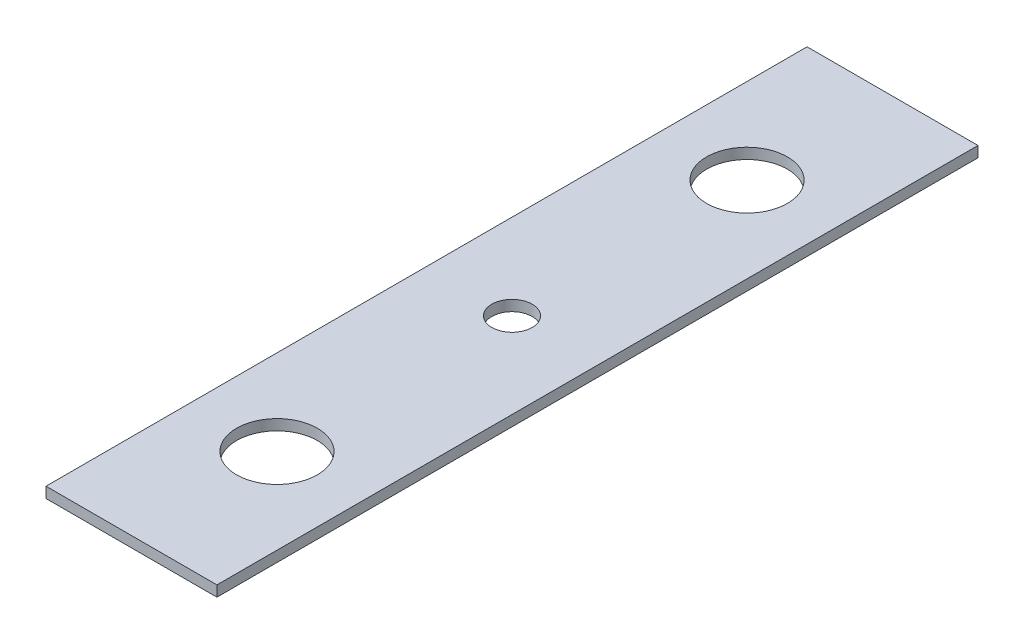
ISO-10303-21;
HEADER;
FILE_DESCRIPTION(('STEP AP214'),'2;1');
FILE_NAME('part.step','',(''),(''),'','','');
FILE_SCHEMA(('AUTOMOTIVE_DESIGN { 1 0 10303 214 1 1 1 1 }'));
ENDSEC;
DATA;
#1=APPLICATION_CONTEXT('core data for automotive mechanical design processes');
#2=APPLICATION_PROTOCOL_DEFINITION('international standard','automotive_design',2000,#1);
#3=PRODUCT_CONTEXT('',#1,'mechanical');
#4=PRODUCT('Part','Part','',(#3));
#5=PRODUCT_RELATED_PRODUCT_CATEGORY('part','',(#4));
#6=PRODUCT_DEFINITION_FORMATION('','',#4);
#7=PRODUCT_DEFINITION_CONTEXT('part definition',#1,'design');
#8=PRODUCT_DEFINITION('design','',#6,#7);
#9=PRODUCT_DEFINITION_SHAPE('','',#8);
#10=(LENGTH_UNIT() NAMED_UNIT(*) SI_UNIT(.MILLI.,.METRE.));
#11=(NAMED_UNIT(*) PLANE_ANGLE_UNIT() SI_UNIT($,.RADIAN.));
#12=(NAMED_UNIT(*) SI_UNIT($,.STERADIAN.) SOLID_ANGLE_UNIT());
#13=UNCERTAINTY_MEASURE_WITH_UNIT(LENGTH_MEASURE(1.E-05),#10,'distance_accuracy_value','');
#14=(GEOMETRIC_REPRESENTATION_CONTEXT(3) GLOBAL_UNCERTAINTY_ASSIGNED_CONTEXT((#13)) GLOBAL_UNIT_ASSIGNED_CONTEXT((#10,
#11,#12)) REPRESENTATION_CONTEXT('',''));
#15=CARTESIAN_POINT('',(0.,0.,0.));
#16=DIRECTION('',(0.,0.,1.));
#17=DIRECTION('',(1.,0.,0.));
#18=AXIS2_PLACEMENT_3D('',#15,#16,#17);
#19=CARTESIAN_POINT('',(0.,0.79375,0.));
#20=DIRECTION('',(0.,1.,0.));
#21=DIRECTION('',(0.,0.,1.));
#22=AXIS2_PLACEMENT_3D('',#19,#20,#21);
#23=PLANE('',#22);
#24=CARTESIAN_POINT('',(202.847582206888,0.79375,-25.0290382764822));
#25=DIRECTION('',(0.,1.,0.));
#26=DIRECTION('',(0.,0.,1.));
#27=AXIS2_PLACEMENT_3D('',#24,#25,#26);
#28=CIRCLE('',#27,1.5);
#29=CARTESIAN_POINT('',(202.847582206888,0.79375,-23.5290382764822));
#30=VERTEX_POINT('',#29);
#31=EDGE_CURVE('E125',#30,#30,#28,.T.);
#32=ORIENTED_EDGE('',*,*,#31,.F.);
#33=EDGE_LOOP('',(#32));
#34=FACE_BOUND('',#33,.T.);
#35=DIRECTION('',(-1.,0.,0.));
#36=VECTOR('',#35,1.);
#37=CARTESIAN_POINT('',(209.197582206888,0.79375,-53.3040382764822));
#38=LINE('',#37,#36);
#39=CARTESIAN_POINT('',(209.197582206888,0.79375,-53.3040382764822));
#40=VERTEX_POINT('',#39);
#41=CARTESIAN_POINT('',(196.497582206888,0.79375,-53.3040382764822));
#42=VERTEX_POINT('',#41);
#43=EDGE_CURVE('E95',#40,#42,#38,.T.);
#44=ORIENTED_EDGE('',*,*,#43,.T.);
#45=DIRECTION('',(0.,0.,1.));
#46=VECTOR('',#45,1.);
#47=CARTESIAN_POINT('',(196.497582206888,0.79375,-53.3040382764822));
#48=LINE('',#47,#46);
#49=CARTESIAN_POINT('',(196.497582206888,0.79375,3.24596172351784));
#50=VERTEX_POINT('',#49);
#51=EDGE_CURVE('E90',#42,#50,#48,.T.);
#52=ORIENTED_EDGE('',*,*,#51,.T.);
#53=DIRECTION('',(1.,0.,0.));
#54=VECTOR('',#53,1.);
#55=CARTESIAN_POINT('',(196.497582206888,0.79375,3.24596172351784));
#56=LINE('',#55,#54);
#57=CARTESIAN_POINT('',(209.197582206888,0.79375,3.24596172351784));
#58=VERTEX_POINT('',#57);
#59=EDGE_CURVE('E93',#50,#58,#56,.T.);
#60=ORIENTED_EDGE('',*,*,#59,.T.);
#61=DIRECTION('',(0.,0.,-1.));
#62=VECTOR('',#61,1.);
#63=CARTESIAN_POINT('',(209.197582206888,0.79375,3.24596172351784));
#64=LINE('',#63,#62);
#65=EDGE_CURVE('E60',#58,#40,#64,.T.);
#66=ORIENTED_EDGE('',*,*,#65,.T.);
#67=EDGE_LOOP('',(#44,#52,#60,#66));
#68=FACE_BOUND('',#67,.T.);
#69=CARTESIAN_POINT('',(202.847582206888,0.79375,-7.56653827648216));
#70=DIRECTION('',(0.,1.,0.));
#71=DIRECTION('',(0.,0.,1.));
#72=AXIS2_PLACEMENT_3D('',#69,#70,#71);
#73=CIRCLE('',#72,2.99999999999999);
#74=CARTESIAN_POINT('',(202.847582206888,0.79375,-4.56653827648217));
#75=VERTEX_POINT('',#74);
#76=EDGE_CURVE('E110',#75,#75,#73,.T.);
#77=ORIENTED_EDGE('',*,*,#76,.F.);
#78=EDGE_LOOP('',(#77));
#79=FACE_BOUND('',#78,.T.);
#80=CARTESIAN_POINT('',(202.847582206888,0.79375,-42.4915382764822));
#81=DIRECTION('',(0.,1.,0.));
#82=DIRECTION('',(0.,0.,1.));
#83=AXIS2_PLACEMENT_3D('',#80,#81,#82);
#84=CIRCLE('',#83,2.99999999999999);
#85=CARTESIAN_POINT('',(202.847582206888,0.79375,-39.4915382764822));
#86=VERTEX_POINT('',#85);
#87=EDGE_CURVE('E131',#86,#86,#84,.T.);
#88=ORIENTED_EDGE('',*,*,#87,.F.);
#89=EDGE_LOOP('',(#88));
#90=FACE_BOUND('',#89,.T.);
#91=ADVANCED_FACE('F43',(#34,#68,#79,#90),#23,.T.);
#92=CARTESIAN_POINT('',(0.,0.,0.));
#93=DIRECTION('',(0.,1.,0.));
#94=DIRECTION('',(0.,0.,1.));
#95=AXIS2_PLACEMENT_3D('',#92,#93,#94);
#96=PLANE('',#95);
#97=DIRECTION('',(-1.,0.,0.));
#98=VECTOR('',#97,1.);
#99=CARTESIAN_POINT('',(209.197582206888,0.,-53.3040382764822));
#100=LINE('',#99,#98);
#101=CARTESIAN_POINT('',(209.197582206888,0.,-53.3040382764822));
#102=VERTEX_POINT('',#101);
#103=CARTESIAN_POINT('',(196.497582206888,0.,-53.3040382764822));
#104=VERTEX_POINT('',#103);
#105=EDGE_CURVE('E107',#102,#104,#100,.T.);
#106=ORIENTED_EDGE('',*,*,#105,.F.);
#107=DIRECTION('',(0.,0.,-1.));
#108=VECTOR('',#107,1.);
#109=CARTESIAN_POINT('',(209.197582206888,0.,3.24596172351784));
#110=LINE('',#109,#108);
#111=CARTESIAN_POINT('',(209.197582206888,0.,3.24596172351784));
#112=VERTEX_POINT('',#111);
#113=EDGE_CURVE('E83',#112,#102,#110,.T.);
#114=ORIENTED_EDGE('',*,*,#113,.F.);
#115=DIRECTION('',(1.,0.,0.));
#116=VECTOR('',#115,1.);
#117=CARTESIAN_POINT('',(196.497582206888,0.,3.24596172351784));
#118=LINE('',#117,#116);
#119=CARTESIAN_POINT('',(196.497582206888,0.,3.24596172351784));
#120=VERTEX_POINT('',#119);
#121=EDGE_CURVE('E77',#120,#112,#118,.T.);
#122=ORIENTED_EDGE('',*,*,#121,.F.);
#123=DIRECTION('',(0.,0.,1.));
#124=VECTOR('',#123,1.);
#125=CARTESIAN_POINT('',(196.497582206888,0.,-53.3040382764822));
#126=LINE('',#125,#124);
#127=EDGE_CURVE('E99',#104,#120,#126,.T.);
#128=ORIENTED_EDGE('',*,*,#127,.F.);
#129=EDGE_LOOP('',(#106,#114,#122,#128));
#130=FACE_BOUND('',#129,.T.);
#131=CARTESIAN_POINT('',(202.847582206888,0.,-7.56653827648216));
#132=DIRECTION('',(0.,1.,0.));
#133=DIRECTION('',(0.,0.,1.));
#134=AXIS2_PLACEMENT_3D('',#131,#132,#133);
#135=CIRCLE('',#134,2.99999999999999);
#136=CARTESIAN_POINT('',(202.847582206888,0.,-4.56653827648217));
#137=VERTEX_POINT('',#136);
#138=EDGE_CURVE('E122',#137,#137,#135,.T.);
#139=ORIENTED_EDGE('',*,*,#138,.T.);
#140=EDGE_LOOP('',(#139));
#141=FACE_BOUND('',#140,.T.);
#142=CARTESIAN_POINT('',(202.847582206888,0.,-25.0290382764822));
#143=DIRECTION('',(0.,1.,0.));
#144=DIRECTION('',(0.,0.,1.));
#145=AXIS2_PLACEMENT_3D('',#142,#143,#144);
#146=CIRCLE('',#145,1.5);
#147=CARTESIAN_POINT('',(202.847582206888,0.,-23.5290382764822));
#148=VERTEX_POINT('',#147);
#149=EDGE_CURVE('E128',#148,#148,#146,.T.);
#150=ORIENTED_EDGE('',*,*,#149,.T.);
#151=EDGE_LOOP('',(#150));
#152=FACE_BOUND('',#151,.T.);
#153=CARTESIAN_POINT('',(202.847582206888,0.,-42.4915382764822));
#154=DIRECTION('',(0.,1.,0.));
#155=DIRECTION('',(0.,0.,1.));
#156=AXIS2_PLACEMENT_3D('',#153,#154,#155);
#157=CIRCLE('',#156,2.99999999999999);
#158=CARTESIAN_POINT('',(202.847582206888,0.,-39.4915382764822));
#159=VERTEX_POINT('',#158);
#160=EDGE_CURVE('E134',#159,#159,#157,.T.);
#161=ORIENTED_EDGE('',*,*,#160,.T.);
#162=EDGE_LOOP('',(#161));
#163=FACE_BOUND('',#162,.T.);
#164=ADVANCED_FACE('F118',(#130,#141,#152,#163),#96,.F.);
#165=CARTESIAN_POINT('',(209.197582206888,0.79375,-53.3040382764822));
#166=DIRECTION('',(0.,0.,1.));
#167=DIRECTION('',(1.,0.,0.));
#168=AXIS2_PLACEMENT_3D('',#165,#166,#167);
#169=PLANE('',#168);
#170=ORIENTED_EDGE('',*,*,#105,.T.);
#171=DIRECTION('',(0.,-1.,0.));
#172=VECTOR('',#171,1.);
#173=CARTESIAN_POINT('',(196.497582206888,0.79375,-53.3040382764822));
#174=LINE('',#173,#172);
#175=EDGE_CURVE('E11',#42,#104,#174,.T.);
#176=ORIENTED_EDGE('',*,*,#175,.F.);
#177=ORIENTED_EDGE('',*,*,#43,.F.);
#178=DIRECTION('',(0.,-1.,0.));
#179=VECTOR('',#178,1.);
#180=CARTESIAN_POINT('',(209.197582206888,0.79375,-53.3040382764822));
#181=LINE('',#180,#179);
#182=EDGE_CURVE('E103',#40,#102,#181,.T.);
#183=ORIENTED_EDGE('',*,*,#182,.T.);
#184=EDGE_LOOP('',(#170,#176,#177,#183));
#185=FACE_BOUND('',#184,.T.);
#186=ADVANCED_FACE('F45',(#185),#169,.F.);
#187=CARTESIAN_POINT('',(196.497582206888,0.79375,-53.3040382764822));
#188=DIRECTION('',(1.,0.,0.));
#189=DIRECTION('',(0.,0.,-1.));
#190=AXIS2_PLACEMENT_3D('',#187,#188,#189);
#191=PLANE('',#190);
#192=ORIENTED_EDGE('',*,*,#127,.T.);
#193=DIRECTION('',(0.,-1.,0.));
#194=VECTOR('',#193,1.);
#195=CARTESIAN_POINT('',(196.497582206888,0.79375,3.24596172351784));
#196=LINE('',#195,#194);
#197=EDGE_CURVE('E52',#50,#120,#196,.T.);
#198=ORIENTED_EDGE('',*,*,#197,.F.);
#199=ORIENTED_EDGE('',*,*,#51,.F.);
#200=ORIENTED_EDGE('',*,*,#175,.T.);
#201=EDGE_LOOP('',(#192,#198,#199,#200));
#202=FACE_BOUND('',#201,.T.);
#203=ADVANCED_FACE('F98',(#202),#191,.F.);
#204=CARTESIAN_POINT('',(196.497582206888,0.79375,3.24596172351784));
#205=DIRECTION('',(0.,0.,-1.));
#206=DIRECTION('',(-1.,0.,0.));
#207=AXIS2_PLACEMENT_3D('',#204,#205,#206);
#208=PLANE('',#207);
#209=ORIENTED_EDGE('',*,*,#121,.T.);
#210=DIRECTION('',(0.,-1.,0.));
#211=VECTOR('',#210,1.);
#212=CARTESIAN_POINT('',(209.197582206888,0.79375,3.24596172351784));
#213=LINE('',#212,#211);
#214=EDGE_CURVE('E100',#58,#112,#213,.T.);
#215=ORIENTED_EDGE('',*,*,#214,.F.);
#216=ORIENTED_EDGE('',*,*,#59,.F.);
#217=ORIENTED_EDGE('',*,*,#197,.T.);
#218=EDGE_LOOP('',(#209,#215,#216,#217));
#219=FACE_BOUND('',#218,.T.);
#220=ADVANCED_FACE('F101',(#219),#208,.F.);
#221=CARTESIAN_POINT('',(209.197582206888,0.79375,3.24596172351784));
#222=DIRECTION('',(-1.,0.,0.));
#223=DIRECTION('',(0.,0.,1.));
#224=AXIS2_PLACEMENT_3D('',#221,#222,#223);
#225=PLANE('',#224);
#226=ORIENTED_EDGE('',*,*,#113,.T.);
#227=ORIENTED_EDGE('',*,*,#182,.F.);
#228=ORIENTED_EDGE('',*,*,#65,.F.);
#229=ORIENTED_EDGE('',*,*,#214,.T.);
#230=EDGE_LOOP('',(#226,#227,#228,#229));
#231=FACE_BOUND('',#230,.T.);
#232=ADVANCED_FACE('F115',(#231),#225,.F.);
#233=CARTESIAN_POINT('',(202.847582206888,0.79375,-7.56653827648216));
#234=DIRECTION('',(0.,-1.,0.));
#235=DIRECTION('',(0.,0.,-1.));
#236=AXIS2_PLACEMENT_3D('',#233,#234,#235);
#237=CYLINDRICAL_SURFACE('',#236,2.99999999999999);
#238=ORIENTED_EDGE('',*,*,#76,.T.);
#239=EDGE_LOOP('',(#238));
#240=FACE_BOUND('',#239,.T.);
#241=ORIENTED_EDGE('',*,*,#138,.F.);
#242=EDGE_LOOP('',(#241));
#243=FACE_BOUND('',#242,.T.);
#244=ADVANCED_FACE('F152',(#240,#243),#237,.F.);
#245=CARTESIAN_POINT('',(202.847582206888,0.79375,-25.0290382764822));
#246=DIRECTION('',(0.,-1.,0.));
#247=DIRECTION('',(0.,0.,-1.));
#248=AXIS2_PLACEMENT_3D('',#245,#246,#247);
#249=CYLINDRICAL_SURFACE('',#248,1.5);
#250=ORIENTED_EDGE('',*,*,#31,.T.);
#251=EDGE_LOOP('',(#250));
#252=FACE_BOUND('',#251,.T.);
#253=ORIENTED_EDGE('',*,*,#149,.F.);
#254=EDGE_LOOP('',(#253));
#255=FACE_BOUND('',#254,.T.);
#256=ADVANCED_FACE('F197',(#252,#255),#249,.F.);
#257=CARTESIAN_POINT('',(202.847582206888,0.79375,-42.4915382764822));
#258=DIRECTION('',(0.,-1.,0.));
#259=DIRECTION('',(0.,0.,-1.));
#260=AXIS2_PLACEMENT_3D('',#257,#258,#259);
#261=CYLINDRICAL_SURFACE('',#260,2.99999999999999);
#262=ORIENTED_EDGE('',*,*,#87,.T.);
#263=EDGE_LOOP('',(#262));
#264=FACE_BOUND('',#263,.T.);
#265=ORIENTED_EDGE('',*,*,#160,.F.);
#266=EDGE_LOOP('',(#265));
#267=FACE_BOUND('',#266,.T.);
#268=ADVANCED_FACE('F140',(#264,#267),#261,.F.);
#269=CLOSED_SHELL('',(#91,#164,#186,#203,#220,#232,#244,#256,#268));
#270=MANIFOLD_SOLID_BREP('B2',#269);
#271=ADVANCED_BREP_SHAPE_REPRESENTATION('',(#18,#270),#14);
#272=SHAPE_DEFINITION_REPRESENTATION(#9,#271);
ENDSEC;
END-ISO-10303-21;
